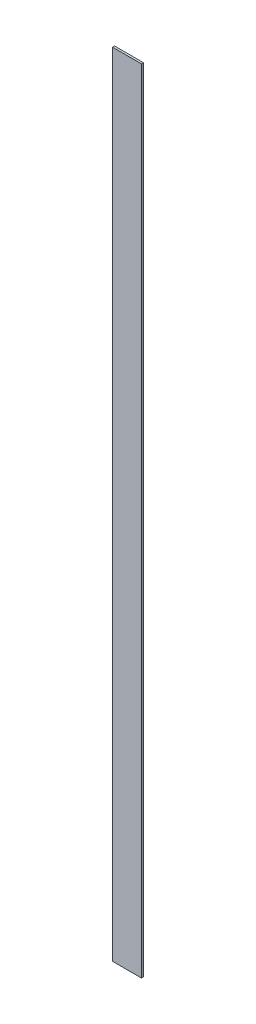
ISO-10303-21;
HEADER;
FILE_DESCRIPTION(('STEP AP214'),'2;1');
FILE_NAME('part.step','',(''),(''),'','','');
FILE_SCHEMA(('AUTOMOTIVE_DESIGN { 1 0 10303 214 1 1 1 1 }'));
ENDSEC;
DATA;
#1=APPLICATION_CONTEXT('core data for automotive mechanical design processes');
#2=APPLICATION_PROTOCOL_DEFINITION('international standard','automotive_design',2000,#1);
#3=PRODUCT_CONTEXT('',#1,'mechanical');
#4=PRODUCT('Part','Part','',(#3));
#5=PRODUCT_RELATED_PRODUCT_CATEGORY('part','',(#4));
#6=PRODUCT_DEFINITION_FORMATION('','',#4);
#7=PRODUCT_DEFINITION_CONTEXT('part definition',#1,'design');
#8=PRODUCT_DEFINITION('design','',#6,#7);
#9=PRODUCT_DEFINITION_SHAPE('','',#8);
#10=(LENGTH_UNIT() NAMED_UNIT(*) SI_UNIT(.MILLI.,.METRE.));
#11=(NAMED_UNIT(*) PLANE_ANGLE_UNIT() SI_UNIT($,.RADIAN.));
#12=(NAMED_UNIT(*) SI_UNIT($,.STERADIAN.) SOLID_ANGLE_UNIT());
#13=UNCERTAINTY_MEASURE_WITH_UNIT(LENGTH_MEASURE(1.E-05),#10,'distance_accuracy_value','');
#14=(GEOMETRIC_REPRESENTATION_CONTEXT(3) GLOBAL_UNCERTAINTY_ASSIGNED_CONTEXT((#13)) GLOBAL_UNIT_ASSIGNED_CONTEXT((#10,
#11,#12)) REPRESENTATION_CONTEXT('',''));
#15=CARTESIAN_POINT('',(0.,0.,0.));
#16=DIRECTION('',(0.,0.,1.));
#17=DIRECTION('',(1.,0.,0.));
#18=AXIS2_PLACEMENT_3D('',#15,#16,#17);
#19=CARTESIAN_POINT('',(31.5724960288573,1219.2,9.1799223402645));
#20=DIRECTION('',(-1.,0.,0.));
#21=DIRECTION('',(0.,0.,1.));
#22=AXIS2_PLACEMENT_3D('',#19,#20,#21);
#23=PLANE('',#22);
#24=DIRECTION('',(0.,0.,-1.));
#25=VECTOR('',#24,1.);
#26=CARTESIAN_POINT('',(31.5724960288573,0.,9.1799223402645));
#27=LINE('',#26,#25);
#28=CARTESIAN_POINT('',(31.5724960288573,0.,9.1799223402645));
#29=VERTEX_POINT('',#28);
#30=CARTESIAN_POINT('',(31.5724960288573,0.,6.0049223402645));
#31=VERTEX_POINT('',#30);
#32=EDGE_CURVE('E81',#29,#31,#27,.T.);
#33=ORIENTED_EDGE('',*,*,#32,.T.);
#34=DIRECTION('',(0.,-1.,0.));
#35=VECTOR('',#34,1.);
#36=CARTESIAN_POINT('',(31.5724960288573,1219.2,6.0049223402645));
#37=LINE('',#36,#35);
#38=CARTESIAN_POINT('',(31.5724960288573,1219.2,6.0049223402645));
#39=VERTEX_POINT('',#38);
#40=EDGE_CURVE('E10',#39,#31,#37,.T.);
#41=ORIENTED_EDGE('',*,*,#40,.F.);
#42=DIRECTION('',(0.,0.,-1.));
#43=VECTOR('',#42,1.);
#44=CARTESIAN_POINT('',(31.5724960288573,1219.2,9.1799223402645));
#45=LINE('',#44,#43);
#46=CARTESIAN_POINT('',(31.5724960288573,1219.2,9.1799223402645));
#47=VERTEX_POINT('',#46);
#48=EDGE_CURVE('E67',#47,#39,#45,.T.);
#49=ORIENTED_EDGE('',*,*,#48,.F.);
#50=DIRECTION('',(0.,-1.,0.));
#51=VECTOR('',#50,1.);
#52=CARTESIAN_POINT('',(31.5724960288573,1219.2,9.1799223402645));
#53=LINE('',#52,#51);
#54=EDGE_CURVE('E75',#47,#29,#53,.T.);
#55=ORIENTED_EDGE('',*,*,#54,.T.);
#56=EDGE_LOOP('',(#33,#41,#49,#55));
#57=FACE_BOUND('',#56,.T.);
#58=ADVANCED_FACE('F16',(#57),#23,.F.);
#59=CARTESIAN_POINT('',(31.5724960288573,1219.2,6.0049223402645));
#60=DIRECTION('',(0.,0.,1.));
#61=DIRECTION('',(1.,0.,0.));
#62=AXIS2_PLACEMENT_3D('',#59,#60,#61);
#63=PLANE('',#62);
#64=DIRECTION('',(-1.,0.,0.));
#65=VECTOR('',#64,1.);
#66=CARTESIAN_POINT('',(31.5724960288573,0.,6.0049223402645));
#67=LINE('',#66,#65);
#68=CARTESIAN_POINT('',(-12.8775039711427,0.,6.0049223402645));
#69=VERTEX_POINT('',#68);
#70=EDGE_CURVE('E71',#31,#69,#67,.T.);
#71=ORIENTED_EDGE('',*,*,#70,.T.);
#72=DIRECTION('',(0.,-1.,0.));
#73=VECTOR('',#72,1.);
#74=CARTESIAN_POINT('',(-12.8775039711427,1219.2,6.0049223402645));
#75=LINE('',#74,#73);
#76=CARTESIAN_POINT('',(-12.8775039711427,1219.2,6.0049223402645));
#77=VERTEX_POINT('',#76);
#78=EDGE_CURVE('E24',#77,#69,#75,.T.);
#79=ORIENTED_EDGE('',*,*,#78,.F.);
#80=DIRECTION('',(-1.,0.,0.));
#81=VECTOR('',#80,1.);
#82=CARTESIAN_POINT('',(31.5724960288573,1219.2,6.0049223402645));
#83=LINE('',#82,#81);
#84=EDGE_CURVE('E62',#39,#77,#83,.T.);
#85=ORIENTED_EDGE('',*,*,#84,.F.);
#86=ORIENTED_EDGE('',*,*,#40,.T.);
#87=EDGE_LOOP('',(#71,#79,#85,#86));
#88=FACE_BOUND('',#87,.T.);
#89=ADVANCED_FACE('F70',(#88),#63,.F.);
#90=CARTESIAN_POINT('',(-12.8775039711427,1219.2,6.0049223402645));
#91=DIRECTION('',(1.,0.,0.));
#92=DIRECTION('',(0.,0.,-1.));
#93=AXIS2_PLACEMENT_3D('',#90,#91,#92);
#94=PLANE('',#93);
#95=DIRECTION('',(0.,0.,1.));
#96=VECTOR('',#95,1.);
#97=CARTESIAN_POINT('',(-12.8775039711427,0.,6.0049223402645));
#98=LINE('',#97,#96);
#99=CARTESIAN_POINT('',(-12.8775039711427,0.,9.1799223402645));
#100=VERTEX_POINT('',#99);
#101=EDGE_CURVE('E49',#69,#100,#98,.T.);
#102=ORIENTED_EDGE('',*,*,#101,.T.);
#103=DIRECTION('',(0.,-1.,0.));
#104=VECTOR('',#103,1.);
#105=CARTESIAN_POINT('',(-12.8775039711427,1219.2,9.1799223402645));
#106=LINE('',#105,#104);
#107=CARTESIAN_POINT('',(-12.8775039711427,1219.2,9.1799223402645));
#108=VERTEX_POINT('',#107);
#109=EDGE_CURVE('E72',#108,#100,#106,.T.);
#110=ORIENTED_EDGE('',*,*,#109,.F.);
#111=DIRECTION('',(0.,0.,1.));
#112=VECTOR('',#111,1.);
#113=CARTESIAN_POINT('',(-12.8775039711427,1219.2,6.0049223402645));
#114=LINE('',#113,#112);
#115=EDGE_CURVE('E65',#77,#108,#114,.T.);
#116=ORIENTED_EDGE('',*,*,#115,.F.);
#117=ORIENTED_EDGE('',*,*,#78,.T.);
#118=EDGE_LOOP('',(#102,#110,#116,#117));
#119=FACE_BOUND('',#118,.T.);
#120=ADVANCED_FACE('F73',(#119),#94,.F.);
#121=CARTESIAN_POINT('',(-12.8775039711427,1219.2,9.1799223402645));
#122=DIRECTION('',(0.,0.,-1.));
#123=DIRECTION('',(-1.,0.,0.));
#124=AXIS2_PLACEMENT_3D('',#121,#122,#123);
#125=PLANE('',#124);
#126=DIRECTION('',(1.,0.,0.));
#127=VECTOR('',#126,1.);
#128=CARTESIAN_POINT('',(-12.8775039711427,0.,9.1799223402645));
#129=LINE('',#128,#127);
#130=EDGE_CURVE('E55',#100,#29,#129,.T.);
#131=ORIENTED_EDGE('',*,*,#130,.T.);
#132=ORIENTED_EDGE('',*,*,#54,.F.);
#133=DIRECTION('',(1.,0.,0.));
#134=VECTOR('',#133,1.);
#135=CARTESIAN_POINT('',(-12.8775039711427,1219.2,9.1799223402645));
#136=LINE('',#135,#134);
#137=EDGE_CURVE('E32',#108,#47,#136,.T.);
#138=ORIENTED_EDGE('',*,*,#137,.F.);
#139=ORIENTED_EDGE('',*,*,#109,.T.);
#140=EDGE_LOOP('',(#131,#132,#138,#139));
#141=FACE_BOUND('',#140,.T.);
#142=ADVANCED_FACE('F90',(#141),#125,.F.);
#143=CARTESIAN_POINT('',(0.,1219.2,0.));
#144=DIRECTION('',(0.,1.,0.));
#145=DIRECTION('',(0.,0.,1.));
#146=AXIS2_PLACEMENT_3D('',#143,#144,#145);
#147=PLANE('',#146);
#148=ORIENTED_EDGE('',*,*,#48,.T.);
#149=ORIENTED_EDGE('',*,*,#84,.T.);
#150=ORIENTED_EDGE('',*,*,#115,.T.);
#151=ORIENTED_EDGE('',*,*,#137,.T.);
#152=EDGE_LOOP('',(#148,#149,#150,#151));
#153=FACE_BOUND('',#152,.T.);
#154=ADVANCED_FACE('F63',(#153),#147,.T.);
#155=CARTESIAN_POINT('',(0.,0.,0.));
#156=DIRECTION('',(0.,1.,0.));
#157=DIRECTION('',(0.,0.,1.));
#158=AXIS2_PLACEMENT_3D('',#155,#156,#157);
#159=PLANE('',#158);
#160=ORIENTED_EDGE('',*,*,#32,.F.);
#161=ORIENTED_EDGE('',*,*,#130,.F.);
#162=ORIENTED_EDGE('',*,*,#101,.F.);
#163=ORIENTED_EDGE('',*,*,#70,.F.);
#164=EDGE_LOOP('',(#160,#161,#162,#163));
#165=FACE_BOUND('',#164,.T.);
#166=ADVANCED_FACE('F93',(#165),#159,.F.);
#167=CLOSED_SHELL('',(#58,#89,#120,#142,#154,#166));
#168=MANIFOLD_SOLID_BREP('B1',#167);
#169=ADVANCED_BREP_SHAPE_REPRESENTATION('',(#18,#168),#14);
#170=SHAPE_DEFINITION_REPRESENTATION(#9,#169);
ENDSEC;
END-ISO-10303-21;
